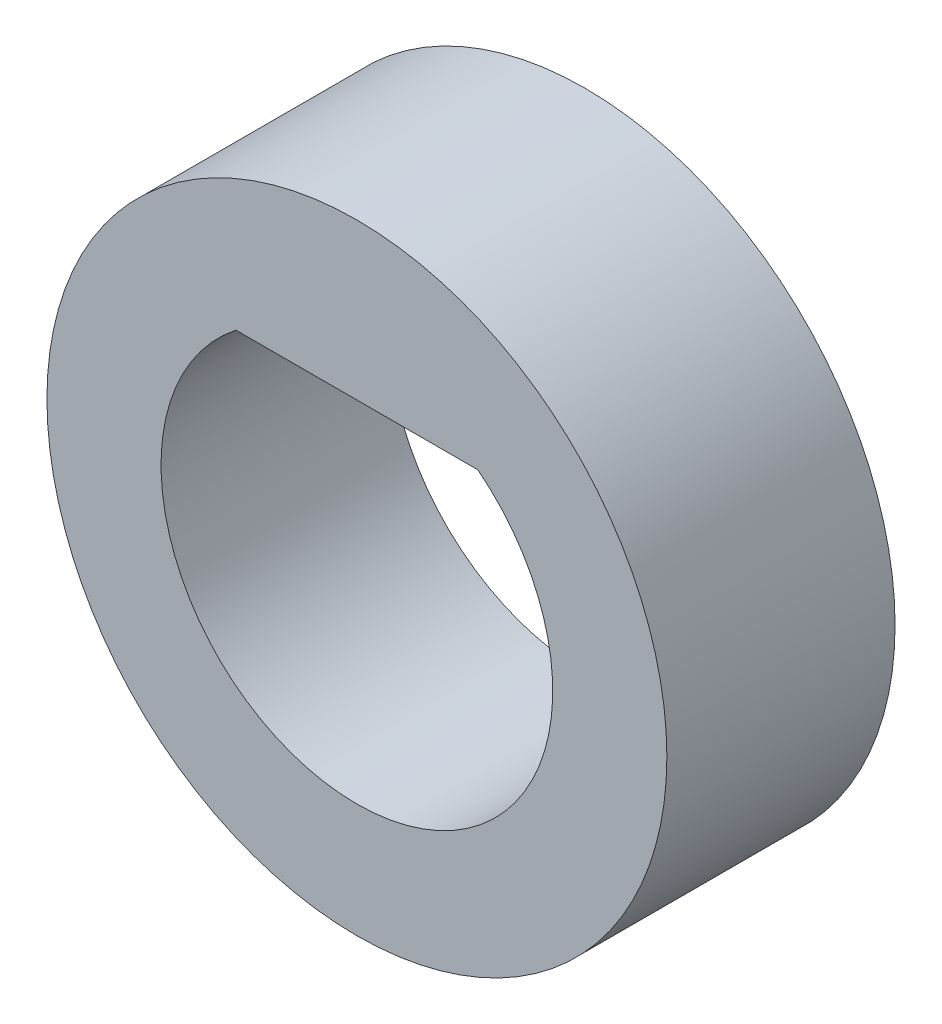
ISO-10303-21;
HEADER;
FILE_DESCRIPTION(('STEP AP214'),'2;1');
FILE_NAME('part.step','',(''),(''),'','','');
FILE_SCHEMA(('AUTOMOTIVE_DESIGN { 1 0 10303 214 1 1 1 1 }'));
ENDSEC;
DATA;
#1=APPLICATION_CONTEXT('core data for automotive mechanical design processes');
#2=APPLICATION_PROTOCOL_DEFINITION('international standard','automotive_design',2000,#1);
#3=PRODUCT_CONTEXT('',#1,'mechanical');
#4=PRODUCT('Part','Part','',(#3));
#5=PRODUCT_RELATED_PRODUCT_CATEGORY('part','',(#4));
#6=PRODUCT_DEFINITION_FORMATION('','',#4);
#7=PRODUCT_DEFINITION_CONTEXT('part definition',#1,'design');
#8=PRODUCT_DEFINITION('design','',#6,#7);
#9=PRODUCT_DEFINITION_SHAPE('','',#8);
#10=(LENGTH_UNIT() NAMED_UNIT(*) SI_UNIT(.MILLI.,.METRE.));
#11=(NAMED_UNIT(*) PLANE_ANGLE_UNIT() SI_UNIT($,.RADIAN.));
#12=(NAMED_UNIT(*) SI_UNIT($,.STERADIAN.) SOLID_ANGLE_UNIT());
#13=UNCERTAINTY_MEASURE_WITH_UNIT(LENGTH_MEASURE(1.E-05),#10,'distance_accuracy_value','');
#14=(GEOMETRIC_REPRESENTATION_CONTEXT(3) GLOBAL_UNCERTAINTY_ASSIGNED_CONTEXT((#13)) GLOBAL_UNIT_ASSIGNED_CONTEXT((#10,
#11,#12)) REPRESENTATION_CONTEXT('',''));
#15=CARTESIAN_POINT('',(0.,0.,0.));
#16=DIRECTION('',(0.,0.,1.));
#17=DIRECTION('',(1.,0.,0.));
#18=AXIS2_PLACEMENT_3D('',#15,#16,#17);
#19=CARTESIAN_POINT('',(0.,0.,3.));
#20=DIRECTION('',(0.,0.,1.));
#21=DIRECTION('',(1.,0.,0.));
#22=AXIS2_PLACEMENT_3D('',#19,#20,#21);
#23=PLANE('',#22);
#24=CARTESIAN_POINT('',(0.,0.,3.));
#25=DIRECTION('',(0.,0.,1.));
#26=DIRECTION('',(1.,0.,0.));
#27=AXIS2_PLACEMENT_3D('',#24,#25,#26);
#28=CIRCLE('',#27,4.075);
#29=CARTESIAN_POINT('',(4.075,0.,3.));
#30=VERTEX_POINT('',#29);
#31=EDGE_CURVE('E11',#30,#30,#28,.T.);
#32=ORIENTED_EDGE('',*,*,#31,.T.);
#33=EDGE_LOOP('',(#32));
#34=FACE_BOUND('',#33,.T.);
#35=DIRECTION('',(-1.,0.,0.));
#36=VECTOR('',#35,1.);
#37=CARTESIAN_POINT('',(-1.59059737205869,2.025,3.));
#38=LINE('',#37,#36);
#39=CARTESIAN_POINT('',(1.59059737205869,2.025,3.));
#40=VERTEX_POINT('',#39);
#41=CARTESIAN_POINT('',(-1.59059737205869,2.025,3.));
#42=VERTEX_POINT('',#41);
#43=EDGE_CURVE('E84',#40,#42,#38,.T.);
#44=ORIENTED_EDGE('',*,*,#43,.F.);
#45=CARTESIAN_POINT('',(0.,0.,3.));
#46=DIRECTION('',(0.,0.,1.));
#47=DIRECTION('',(1.,0.,0.));
#48=AXIS2_PLACEMENT_3D('',#45,#46,#47);
#49=CIRCLE('',#48,2.575);
#50=EDGE_CURVE('E73',#42,#40,#49,.T.);
#51=ORIENTED_EDGE('',*,*,#50,.F.);
#52=EDGE_LOOP('',(#44,#51));
#53=FACE_BOUND('',#52,.T.);
#54=ADVANCED_FACE('F39',(#34,#53),#23,.T.);
#55=CARTESIAN_POINT('',(0.,0.,0.));
#56=DIRECTION('',(0.,0.,1.));
#57=DIRECTION('',(1.,0.,0.));
#58=AXIS2_PLACEMENT_3D('',#55,#56,#57);
#59=PLANE('',#58);
#60=CARTESIAN_POINT('',(0.,0.,0.));
#61=DIRECTION('',(0.,0.,1.));
#62=DIRECTION('',(1.,0.,0.));
#63=AXIS2_PLACEMENT_3D('',#60,#61,#62);
#64=CIRCLE('',#63,4.075);
#65=CARTESIAN_POINT('',(4.075,0.,0.));
#66=VERTEX_POINT('',#65);
#67=EDGE_CURVE('E43',#66,#66,#64,.T.);
#68=ORIENTED_EDGE('',*,*,#67,.F.);
#69=EDGE_LOOP('',(#68));
#70=FACE_BOUND('',#69,.T.);
#71=CARTESIAN_POINT('',(0.,0.,0.));
#72=DIRECTION('',(0.,0.,1.));
#73=DIRECTION('',(1.,0.,0.));
#74=AXIS2_PLACEMENT_3D('',#71,#72,#73);
#75=CIRCLE('',#74,2.575);
#76=CARTESIAN_POINT('',(-1.59059737205869,2.025,0.));
#77=VERTEX_POINT('',#76);
#78=CARTESIAN_POINT('',(1.59059737205869,2.025,0.));
#79=VERTEX_POINT('',#78);
#80=EDGE_CURVE('E62',#77,#79,#75,.T.);
#81=ORIENTED_EDGE('',*,*,#80,.T.);
#82=DIRECTION('',(-1.,0.,0.));
#83=VECTOR('',#82,1.);
#84=CARTESIAN_POINT('',(-1.59059737205869,2.025,0.));
#85=LINE('',#84,#83);
#86=EDGE_CURVE('E68',#79,#77,#85,.T.);
#87=ORIENTED_EDGE('',*,*,#86,.T.);
#88=EDGE_LOOP('',(#81,#87));
#89=FACE_BOUND('',#88,.T.);
#90=ADVANCED_FACE('F80',(#70,#89),#59,.F.);
#91=CARTESIAN_POINT('',(0.,0.,3.));
#92=DIRECTION('',(0.,0.,-1.));
#93=DIRECTION('',(-1.,0.,0.));
#94=AXIS2_PLACEMENT_3D('',#91,#92,#93);
#95=CYLINDRICAL_SURFACE('',#94,4.075);
#96=ORIENTED_EDGE('',*,*,#31,.F.);
#97=EDGE_LOOP('',(#96));
#98=FACE_BOUND('',#97,.T.);
#99=ORIENTED_EDGE('',*,*,#67,.T.);
#100=EDGE_LOOP('',(#99));
#101=FACE_BOUND('',#100,.T.);
#102=ADVANCED_FACE('F41',(#98,#101),#95,.T.);
#103=CARTESIAN_POINT('',(0.,0.,3.));
#104=DIRECTION('',(0.,0.,-1.));
#105=DIRECTION('',(-1.,0.,0.));
#106=AXIS2_PLACEMENT_3D('',#103,#104,#105);
#107=CYLINDRICAL_SURFACE('',#106,2.575);
#108=ORIENTED_EDGE('',*,*,#80,.F.);
#109=DIRECTION('',(0.,0.,-1.));
#110=VECTOR('',#109,1.);
#111=CARTESIAN_POINT('',(-1.59059737205869,2.025,3.));
#112=LINE('',#111,#110);
#113=EDGE_CURVE('E70',#42,#77,#112,.T.);
#114=ORIENTED_EDGE('',*,*,#113,.F.);
#115=ORIENTED_EDGE('',*,*,#50,.T.);
#116=DIRECTION('',(0.,0.,-1.));
#117=VECTOR('',#116,1.);
#118=CARTESIAN_POINT('',(1.59059737205869,2.025,3.));
#119=LINE('',#118,#117);
#120=EDGE_CURVE('E55',#40,#79,#119,.T.);
#121=ORIENTED_EDGE('',*,*,#120,.T.);
#122=EDGE_LOOP('',(#108,#114,#115,#121));
#123=FACE_BOUND('',#122,.T.);
#124=ADVANCED_FACE('F75',(#123),#107,.F.);
#125=CARTESIAN_POINT('',(-1.59059737205869,2.025,3.));
#126=DIRECTION('',(0.,-1.,0.));
#127=DIRECTION('',(0.,0.,-1.));
#128=AXIS2_PLACEMENT_3D('',#125,#126,#127);
#129=PLANE('',#128);
#130=ORIENTED_EDGE('',*,*,#86,.F.);
#131=ORIENTED_EDGE('',*,*,#120,.F.);
#132=ORIENTED_EDGE('',*,*,#43,.T.);
#133=ORIENTED_EDGE('',*,*,#113,.T.);
#134=EDGE_LOOP('',(#130,#131,#132,#133));
#135=FACE_BOUND('',#134,.T.);
#136=ADVANCED_FACE('F69',(#135),#129,.T.);
#137=CLOSED_SHELL('',(#54,#90,#102,#124,#136));
#138=MANIFOLD_SOLID_BREP('B2',#137);
#139=ADVANCED_BREP_SHAPE_REPRESENTATION('',(#18,#138),#14);
#140=SHAPE_DEFINITION_REPRESENTATION(#9,#139);
ENDSEC;
END-ISO-10303-21;
